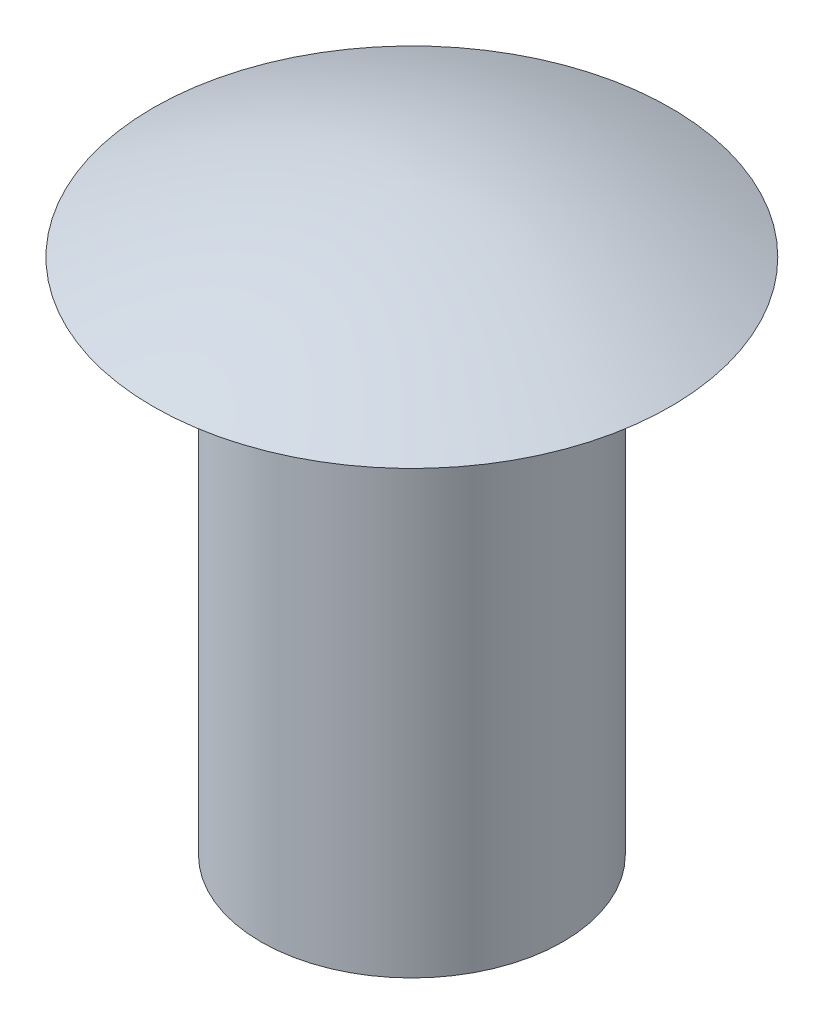
ISO-10303-21;
HEADER;
FILE_DESCRIPTION(('STEP AP214'),'2;1');
FILE_NAME('part.step','',(''),(''),'','','');
FILE_SCHEMA(('AUTOMOTIVE_DESIGN { 1 0 10303 214 1 1 1 1 }'));
ENDSEC;
DATA;
#1=APPLICATION_CONTEXT('core data for automotive mechanical design processes');
#2=APPLICATION_PROTOCOL_DEFINITION('international standard','automotive_design',2000,#1);
#3=PRODUCT_CONTEXT('',#1,'mechanical');
#4=PRODUCT('Part','Part','',(#3));
#5=PRODUCT_RELATED_PRODUCT_CATEGORY('part','',(#4));
#6=PRODUCT_DEFINITION_FORMATION('','',#4);
#7=PRODUCT_DEFINITION_CONTEXT('part definition',#1,'design');
#8=PRODUCT_DEFINITION('design','',#6,#7);
#9=PRODUCT_DEFINITION_SHAPE('','',#8);
#10=(LENGTH_UNIT() NAMED_UNIT(*) SI_UNIT(.MILLI.,.METRE.));
#11=(NAMED_UNIT(*) PLANE_ANGLE_UNIT() SI_UNIT($,.RADIAN.));
#12=(NAMED_UNIT(*) SI_UNIT($,.STERADIAN.) SOLID_ANGLE_UNIT());
#13=UNCERTAINTY_MEASURE_WITH_UNIT(LENGTH_MEASURE(1.E-05),#10,'distance_accuracy_value','');
#14=(GEOMETRIC_REPRESENTATION_CONTEXT(3) GLOBAL_UNCERTAINTY_ASSIGNED_CONTEXT((#13)) GLOBAL_UNIT_ASSIGNED_CONTEXT((#10,
#11,#12)) REPRESENTATION_CONTEXT('',''));
#15=CARTESIAN_POINT('',(0.,0.,0.));
#16=DIRECTION('',(0.,0.,1.));
#17=DIRECTION('',(1.,0.,0.));
#18=AXIS2_PLACEMENT_3D('',#15,#16,#17);
#19=CARTESIAN_POINT('',(0.,6.,0.));
#20=DIRECTION('',(0.,-1.,0.));
#21=DIRECTION('',(0.,0.,-1.));
#22=AXIS2_PLACEMENT_3D('',#19,#20,#21);
#23=CYLINDRICAL_SURFACE('',#22,1.75);
#24=CARTESIAN_POINT('',(0.,6.,0.));
#25=DIRECTION('',(0.,1.,0.));
#26=DIRECTION('',(0.,0.,1.));
#27=AXIS2_PLACEMENT_3D('',#24,#25,#26);
#28=CIRCLE('',#27,1.75);
#29=CARTESIAN_POINT('',(0.,6.,1.75));
#30=VERTEX_POINT('',#29);
#31=EDGE_CURVE('E11',#30,#30,#28,.T.);
#32=ORIENTED_EDGE('',*,*,#31,.F.);
#33=EDGE_LOOP('',(#32));
#34=FACE_BOUND('',#33,.T.);
#35=CARTESIAN_POINT('',(0.,0.,0.));
#36=DIRECTION('',(0.,1.,0.));
#37=DIRECTION('',(0.,0.,1.));
#38=AXIS2_PLACEMENT_3D('',#35,#36,#37);
#39=CIRCLE('',#38,1.75);
#40=CARTESIAN_POINT('',(0.,0.,1.75));
#41=VERTEX_POINT('',#40);
#42=EDGE_CURVE('E46',#41,#41,#39,.T.);
#43=ORIENTED_EDGE('',*,*,#42,.T.);
#44=EDGE_LOOP('',(#43));
#45=FACE_BOUND('',#44,.T.);
#46=ADVANCED_FACE('F43',(#34,#45),#23,.T.);
#47=CARTESIAN_POINT('',(0.,0.,0.));
#48=DIRECTION('',(0.,1.,0.));
#49=DIRECTION('',(0.,0.,1.));
#50=AXIS2_PLACEMENT_3D('',#47,#48,#49);
#51=PLANE('',#50);
#52=ORIENTED_EDGE('',*,*,#42,.F.);
#53=EDGE_LOOP('',(#52));
#54=FACE_BOUND('',#53,.T.);
#55=ADVANCED_FACE('F56',(#54),#51,.F.);
#56=CARTESIAN_POINT('',(0.,6.79687264054139,0.));
#57=CARTESIAN_POINT('',(-1.14462079832687,6.76592266244827,0.));
#58=CARTESIAN_POINT('',(-2.06251758196005,6.43447151631158,0.));
#59=CARTESIAN_POINT('',(-3.,6.,0.));
#60=B_SPLINE_CURVE_WITH_KNOTS('',3,(#56,#57,#58,#59),.UNSPECIFIED.,.F.,.F.,(4,4),(0.,1.),.UNSPECIFIED.);
#61=CARTESIAN_POINT('',(0.,6.79687264054139,0.));
#62=DIRECTION('',(0.,1.,0.));
#63=AXIS1_PLACEMENT('',#61,#62);
#64=SURFACE_OF_REVOLUTION('',#60,#63);
#65=CARTESIAN_POINT('',(0.,6.,0.));
#66=DIRECTION('',(0.,1.,0.));
#67=DIRECTION('',(0.,0.,1.));
#68=AXIS2_PLACEMENT_3D('',#65,#66,#67);
#69=CIRCLE('',#68,3.);
#70=CARTESIAN_POINT('',(0.,6.,3.));
#71=VERTEX_POINT('',#70);
#72=EDGE_CURVE('E77',#71,#71,#69,.T.);
#73=ORIENTED_EDGE('',*,*,#72,.T.);
#74=EDGE_LOOP('',(#73));
#75=FACE_BOUND('',#74,.T.);
#76=CARTESIAN_POINT('',(0.,6.79687264054139,0.));
#77=VERTEX_POINT('',#76);
#78=VERTEX_LOOP('',#77);
#79=FACE_BOUND('',#78,.T.);
#80=ADVANCED_FACE('F53',(#75,#79),#64,.F.);
#81=CARTESIAN_POINT('',(0.,6.,0.));
#82=DIRECTION('',(0.,-1.,0.));
#83=DIRECTION('',(0.,0.,-1.));
#84=AXIS2_PLACEMENT_3D('',#81,#82,#83);
#85=PLANE('',#84);
#86=ORIENTED_EDGE('',*,*,#31,.T.);
#87=EDGE_LOOP('',(#86));
#88=FACE_BOUND('',#87,.T.);
#89=ORIENTED_EDGE('',*,*,#72,.F.);
#90=EDGE_LOOP('',(#89));
#91=FACE_BOUND('',#90,.T.);
#92=ADVANCED_FACE('F55',(#88,#91),#85,.T.);
#93=CLOSED_SHELL('',(#46,#55,#80,#92));
#94=MANIFOLD_SOLID_BREP('B2',#93);
#95=ADVANCED_BREP_SHAPE_REPRESENTATION('',(#18,#94),#14);
#96=SHAPE_DEFINITION_REPRESENTATION(#9,#95);
ENDSEC;
END-ISO-10303-21;
